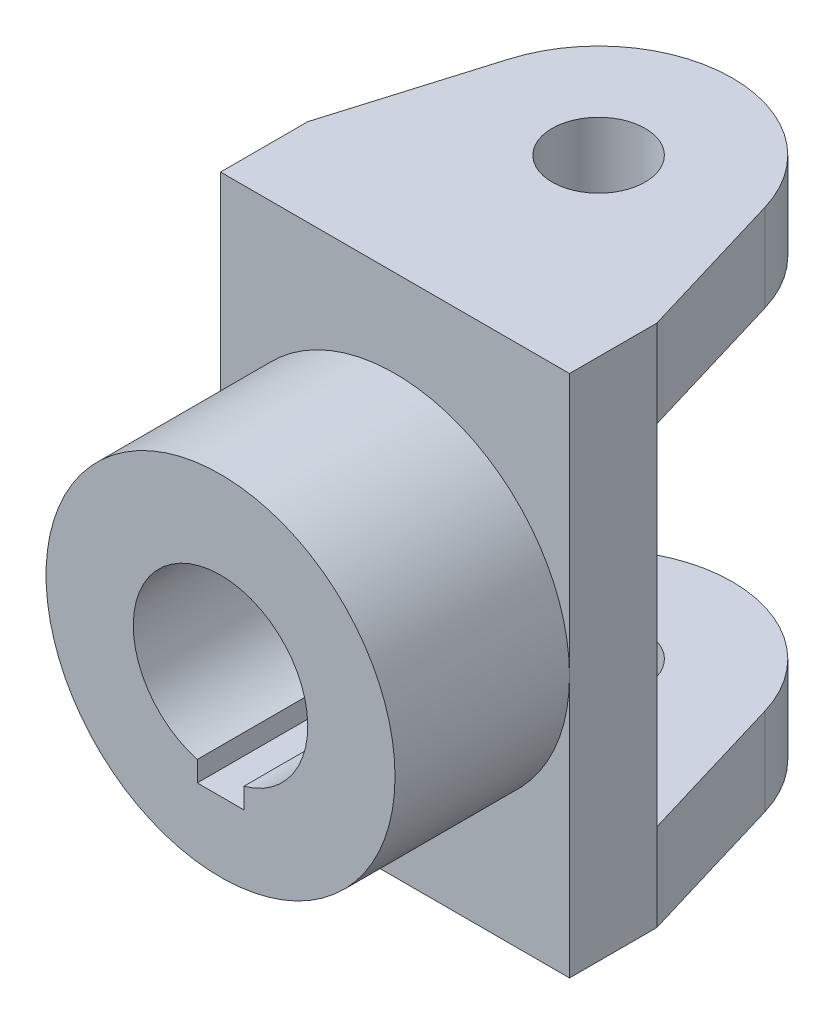
ISO-10303-21;
HEADER;
FILE_DESCRIPTION(('STEP AP214'),'2;1');
FILE_NAME('part.step','',(''),(''),'','','');
FILE_SCHEMA(('AUTOMOTIVE_DESIGN { 1 0 10303 214 1 1 1 1 }'));
ENDSEC;
DATA;
#1=APPLICATION_CONTEXT('core data for automotive mechanical design processes');
#2=APPLICATION_PROTOCOL_DEFINITION('international standard','automotive_design',2000,#1);
#3=PRODUCT_CONTEXT('',#1,'mechanical');
#4=PRODUCT('Part','Part','',(#3));
#5=PRODUCT_RELATED_PRODUCT_CATEGORY('part','',(#4));
#6=PRODUCT_DEFINITION_FORMATION('','',#4);
#7=PRODUCT_DEFINITION_CONTEXT('part definition',#1,'design');
#8=PRODUCT_DEFINITION('design','',#6,#7);
#9=PRODUCT_DEFINITION_SHAPE('','',#8);
#10=(LENGTH_UNIT() NAMED_UNIT(*) SI_UNIT(.MILLI.,.METRE.));
#11=(NAMED_UNIT(*) PLANE_ANGLE_UNIT() SI_UNIT($,.RADIAN.));
#12=(NAMED_UNIT(*) SI_UNIT($,.STERADIAN.) SOLID_ANGLE_UNIT());
#13=UNCERTAINTY_MEASURE_WITH_UNIT(LENGTH_MEASURE(1.E-05),#10,'distance_accuracy_value','');
#14=(GEOMETRIC_REPRESENTATION_CONTEXT(3) GLOBAL_UNCERTAINTY_ASSIGNED_CONTEXT((#13)) GLOBAL_UNIT_ASSIGNED_CONTEXT((#10,
#11,#12)) REPRESENTATION_CONTEXT('',''));
#15=CARTESIAN_POINT('',(0.,0.,0.));
#16=DIRECTION('',(0.,0.,1.));
#17=DIRECTION('',(1.,0.,0.));
#18=AXIS2_PLACEMENT_3D('',#15,#16,#17);
#19=CARTESIAN_POINT('',(0.,0.,-45.));
#20=DIRECTION('',(0.,0.,1.));
#21=DIRECTION('',(1.,0.,0.));
#22=AXIS2_PLACEMENT_3D('',#19,#20,#21);
#23=PLANE('',#22);
#24=DIRECTION('',(1.,0.,0.));
#25=VECTOR('',#24,1.);
#26=CARTESIAN_POINT('',(0.,-30.,-45.));
#27=LINE('',#26,#25);
#28=CARTESIAN_POINT('',(-30.,-30.,-45.));
#29=VERTEX_POINT('',#28);
#30=CARTESIAN_POINT('',(30.,-30.,-45.));
#31=VERTEX_POINT('',#30);
#32=EDGE_CURVE('E11',#29,#31,#27,.T.);
#33=ORIENTED_EDGE('',*,*,#32,.F.);
#34=DIRECTION('',(0.,1.,0.));
#35=VECTOR('',#34,1.);
#36=CARTESIAN_POINT('',(-30.,45.,-45.));
#37=LINE('',#36,#35);
#38=CARTESIAN_POINT('',(-30.,30.,-45.));
#39=VERTEX_POINT('',#38);
#40=EDGE_CURVE('E217',#29,#39,#37,.T.);
#41=ORIENTED_EDGE('',*,*,#40,.T.);
#42=DIRECTION('',(-1.,0.,0.));
#43=VECTOR('',#42,1.);
#44=CARTESIAN_POINT('',(0.,30.,-45.));
#45=LINE('',#44,#43);
#46=CARTESIAN_POINT('',(30.,30.,-45.));
#47=VERTEX_POINT('',#46);
#48=EDGE_CURVE('E50',#47,#39,#45,.T.);
#49=ORIENTED_EDGE('',*,*,#48,.F.);
#50=DIRECTION('',(0.,-1.,0.));
#51=VECTOR('',#50,1.);
#52=CARTESIAN_POINT('',(30.,45.,-45.));
#53=LINE('',#52,#51);
#54=EDGE_CURVE('E218',#47,#31,#53,.T.);
#55=ORIENTED_EDGE('',*,*,#54,.T.);
#56=EDGE_LOOP('',(#33,#41,#49,#55));
#57=FACE_BOUND('',#56,.T.);
#58=ADVANCED_FACE('F39',(#57),#23,.F.);
#59=CARTESIAN_POINT('',(0.,0.,-30.));
#60=DIRECTION('',(0.,0.,1.));
#61=DIRECTION('',(1.,0.,0.));
#62=AXIS2_PLACEMENT_3D('',#59,#60,#61);
#63=CYLINDRICAL_SURFACE('',#62,30.);
#64=CARTESIAN_POINT('',(0.,0.,-30.));
#65=DIRECTION('',(0.,0.,1.));
#66=DIRECTION('',(1.,0.,0.));
#67=AXIS2_PLACEMENT_3D('',#64,#65,#66);
#68=CIRCLE('',#67,30.);
#69=CARTESIAN_POINT('',(30.,0.,-30.));
#70=VERTEX_POINT('',#69);
#71=CARTESIAN_POINT('',(-30.,0.,-30.));
#72=VERTEX_POINT('',#71);
#73=EDGE_CURVE('E277',#70,#72,#68,.T.);
#74=ORIENTED_EDGE('',*,*,#73,.T.);
#75=EDGE_CURVE('E276',#72,#70,#68,.T.);
#76=ORIENTED_EDGE('',*,*,#75,.T.);
#77=EDGE_LOOP('',(#74,#76));
#78=FACE_BOUND('',#77,.T.);
#79=CARTESIAN_POINT('',(0.,0.,0.));
#80=DIRECTION('',(0.,0.,1.));
#81=DIRECTION('',(1.,0.,0.));
#82=AXIS2_PLACEMENT_3D('',#79,#80,#81);
#83=CIRCLE('',#82,30.);
#84=CARTESIAN_POINT('',(30.,0.,0.));
#85=VERTEX_POINT('',#84);
#86=EDGE_CURVE('E267',#85,#85,#83,.T.);
#87=ORIENTED_EDGE('',*,*,#86,.F.);
#88=EDGE_LOOP('',(#87));
#89=FACE_BOUND('',#88,.T.);
#90=ADVANCED_FACE('F41',(#78,#89),#63,.T.);
#91=CARTESIAN_POINT('',(0.,0.,0.));
#92=DIRECTION('',(0.,0.,1.));
#93=DIRECTION('',(1.,0.,0.));
#94=AXIS2_PLACEMENT_3D('',#91,#92,#93);
#95=PLANE('',#94);
#96=CARTESIAN_POINT('',(0.,0.,0.));
#97=DIRECTION('',(0.,0.,1.));
#98=DIRECTION('',(1.,0.,0.));
#99=AXIS2_PLACEMENT_3D('',#96,#97,#98);
#100=CIRCLE('',#99,15.);
#101=CARTESIAN_POINT('',(4.,-14.456832294801,0.));
#102=VERTEX_POINT('',#101);
#103=CARTESIAN_POINT('',(-4.,-14.456832294801,0.));
#104=VERTEX_POINT('',#103);
#105=EDGE_CURVE('E244',#102,#104,#100,.T.);
#106=ORIENTED_EDGE('',*,*,#105,.F.);
#107=DIRECTION('',(0.,1.,0.));
#108=VECTOR('',#107,1.);
#109=CARTESIAN_POINT('',(4.,-14.456832294801,0.));
#110=LINE('',#109,#108);
#111=CARTESIAN_POINT('',(4.,-17.956832294801,0.));
#112=VERTEX_POINT('',#111);
#113=EDGE_CURVE('E247',#112,#102,#110,.T.);
#114=ORIENTED_EDGE('',*,*,#113,.F.);
#115=DIRECTION('',(1.,0.,0.));
#116=VECTOR('',#115,1.);
#117=CARTESIAN_POINT('',(-4.,-17.956832294801,0.));
#118=LINE('',#117,#116);
#119=CARTESIAN_POINT('',(-4.,-17.956832294801,0.));
#120=VERTEX_POINT('',#119);
#121=EDGE_CURVE('E265',#120,#112,#118,.T.);
#122=ORIENTED_EDGE('',*,*,#121,.F.);
#123=DIRECTION('',(0.,-1.,0.));
#124=VECTOR('',#123,1.);
#125=CARTESIAN_POINT('',(-4.,-14.456832294801,0.));
#126=LINE('',#125,#124);
#127=EDGE_CURVE('E259',#104,#120,#126,.T.);
#128=ORIENTED_EDGE('',*,*,#127,.F.);
#129=EDGE_LOOP('',(#106,#114,#122,#128));
#130=FACE_BOUND('',#129,.T.);
#131=ORIENTED_EDGE('',*,*,#86,.T.);
#132=EDGE_LOOP('',(#131));
#133=FACE_BOUND('',#132,.T.);
#134=ADVANCED_FACE('F307',(#130,#133),#95,.T.);
#135=CARTESIAN_POINT('',(0.,0.,-30.));
#136=DIRECTION('',(0.,0.,1.));
#137=DIRECTION('',(1.,0.,0.));
#138=AXIS2_PLACEMENT_3D('',#135,#136,#137);
#139=CYLINDRICAL_SURFACE('',#138,15.);
#140=ORIENTED_EDGE('',*,*,#105,.T.);
#141=DIRECTION('',(0.,0.,1.));
#142=VECTOR('',#141,1.);
#143=CARTESIAN_POINT('',(-4.,-14.456832294801,-30.));
#144=LINE('',#143,#142);
#145=CARTESIAN_POINT('',(-4.,-14.456832294801,-30.));
#146=VERTEX_POINT('',#145);
#147=EDGE_CURVE('E260',#146,#104,#144,.T.);
#148=ORIENTED_EDGE('',*,*,#147,.F.);
#149=CARTESIAN_POINT('',(0.,0.,-30.));
#150=DIRECTION('',(0.,0.,1.));
#151=DIRECTION('',(1.,0.,0.));
#152=AXIS2_PLACEMENT_3D('',#149,#150,#151);
#153=CIRCLE('',#152,15.);
#154=CARTESIAN_POINT('',(4.,-14.456832294801,-30.));
#155=VERTEX_POINT('',#154);
#156=EDGE_CURVE('E241',#155,#146,#153,.T.);
#157=ORIENTED_EDGE('',*,*,#156,.F.);
#158=DIRECTION('',(0.,0.,1.));
#159=VECTOR('',#158,1.);
#160=CARTESIAN_POINT('',(4.,-14.456832294801,-30.));
#161=LINE('',#160,#159);
#162=EDGE_CURVE('E270',#155,#102,#161,.T.);
#163=ORIENTED_EDGE('',*,*,#162,.T.);
#164=EDGE_LOOP('',(#140,#148,#157,#163));
#165=FACE_BOUND('',#164,.T.);
#166=ADVANCED_FACE('F340',(#165),#139,.F.);
#167=CARTESIAN_POINT('',(4.,-14.456832294801,-30.));
#168=DIRECTION('',(1.,0.,0.));
#169=DIRECTION('',(0.,1.,0.));
#170=AXIS2_PLACEMENT_3D('',#167,#168,#169);
#171=PLANE('',#170);
#172=ORIENTED_EDGE('',*,*,#113,.T.);
#173=ORIENTED_EDGE('',*,*,#162,.F.);
#174=DIRECTION('',(0.,1.,0.));
#175=VECTOR('',#174,1.);
#176=CARTESIAN_POINT('',(4.,-14.456832294801,-30.));
#177=LINE('',#176,#175);
#178=CARTESIAN_POINT('',(4.,-17.956832294801,-30.));
#179=VERTEX_POINT('',#178);
#180=EDGE_CURVE('E255',#179,#155,#177,.T.);
#181=ORIENTED_EDGE('',*,*,#180,.F.);
#182=DIRECTION('',(0.,0.,1.));
#183=VECTOR('',#182,1.);
#184=CARTESIAN_POINT('',(4.,-17.956832294801,-30.));
#185=LINE('',#184,#183);
#186=EDGE_CURVE('E269',#179,#112,#185,.T.);
#187=ORIENTED_EDGE('',*,*,#186,.T.);
#188=EDGE_LOOP('',(#172,#173,#181,#187));
#189=FACE_BOUND('',#188,.T.);
#190=ADVANCED_FACE('F334',(#189),#171,.F.);
#191=CARTESIAN_POINT('',(-4.,-17.956832294801,-30.));
#192=DIRECTION('',(0.,-1.,0.));
#193=DIRECTION('',(0.,0.,-1.));
#194=AXIS2_PLACEMENT_3D('',#191,#192,#193);
#195=PLANE('',#194);
#196=ORIENTED_EDGE('',*,*,#121,.T.);
#197=ORIENTED_EDGE('',*,*,#186,.F.);
#198=DIRECTION('',(1.,0.,0.));
#199=VECTOR('',#198,1.);
#200=CARTESIAN_POINT('',(-4.,-17.956832294801,-30.));
#201=LINE('',#200,#199);
#202=CARTESIAN_POINT('',(-4.,-17.956832294801,-30.));
#203=VERTEX_POINT('',#202);
#204=EDGE_CURVE('E253',#203,#179,#201,.T.);
#205=ORIENTED_EDGE('',*,*,#204,.F.);
#206=DIRECTION('',(0.,0.,1.));
#207=VECTOR('',#206,1.);
#208=CARTESIAN_POINT('',(-4.,-17.956832294801,-30.));
#209=LINE('',#208,#207);
#210=EDGE_CURVE('E275',#203,#120,#209,.T.);
#211=ORIENTED_EDGE('',*,*,#210,.T.);
#212=EDGE_LOOP('',(#196,#197,#205,#211));
#213=FACE_BOUND('',#212,.T.);
#214=ADVANCED_FACE('F337',(#213),#195,.F.);
#215=CARTESIAN_POINT('',(-4.,-14.456832294801,-30.));
#216=DIRECTION('',(-1.,0.,0.));
#217=DIRECTION('',(0.,-1.,0.));
#218=AXIS2_PLACEMENT_3D('',#215,#216,#217);
#219=PLANE('',#218);
#220=ORIENTED_EDGE('',*,*,#127,.T.);
#221=ORIENTED_EDGE('',*,*,#210,.F.);
#222=DIRECTION('',(0.,-1.,0.));
#223=VECTOR('',#222,1.);
#224=CARTESIAN_POINT('',(-4.,-14.456832294801,-30.));
#225=LINE('',#224,#223);
#226=EDGE_CURVE('E250',#146,#203,#225,.T.);
#227=ORIENTED_EDGE('',*,*,#226,.F.);
#228=ORIENTED_EDGE('',*,*,#147,.T.);
#229=EDGE_LOOP('',(#220,#221,#227,#228));
#230=FACE_BOUND('',#229,.T.);
#231=ADVANCED_FACE('F325',(#230),#219,.F.);
#232=CARTESIAN_POINT('',(-30.,45.,-45.));
#233=DIRECTION('',(0.,-1.,0.));
#234=DIRECTION('',(1.,0.,0.));
#235=AXIS2_PLACEMENT_3D('',#232,#233,#234);
#236=PLANE('',#235);
#237=DIRECTION('',(1.,0.,0.));
#238=VECTOR('',#237,1.);
#239=CARTESIAN_POINT('',(-30.,45.,-30.));
#240=LINE('',#239,#238);
#241=CARTESIAN_POINT('',(-30.,45.,-30.));
#242=VERTEX_POINT('',#241);
#243=CARTESIAN_POINT('',(30.,45.,-30.));
#244=VERTEX_POINT('',#243);
#245=EDGE_CURVE('E228',#242,#244,#240,.T.);
#246=ORIENTED_EDGE('',*,*,#245,.T.);
#247=DIRECTION('',(0.,0.,1.));
#248=VECTOR('',#247,1.);
#249=CARTESIAN_POINT('',(30.,45.,-45.));
#250=LINE('',#249,#248);
#251=CARTESIAN_POINT('',(30.,45.,-45.));
#252=VERTEX_POINT('',#251);
#253=EDGE_CURVE('E222',#252,#244,#250,.T.);
#254=ORIENTED_EDGE('',*,*,#253,.F.);
#255=DIRECTION('',(-0.286928155857607,0.,-0.957952103905071));
#256=VECTOR('',#255,1.);
#257=CARTESIAN_POINT('',(22.0328983898166,45.,-71.599347584725));
#258=LINE('',#257,#256);
#259=CARTESIAN_POINT('',(22.0328983898166,45.,-71.599347584725));
#260=VERTEX_POINT('',#259);
#261=EDGE_CURVE('E201',#252,#260,#258,.T.);
#262=ORIENTED_EDGE('',*,*,#261,.T.);
#263=CARTESIAN_POINT('',(0.,45.,-65.));
#264=DIRECTION('',(0.,1.,0.));
#265=DIRECTION('',(-1.,0.,0.));
#266=AXIS2_PLACEMENT_3D('',#263,#264,#265);
#267=CIRCLE('',#266,23.);
#268=CARTESIAN_POINT('',(-22.0328983898166,45.,-71.599347584725));
#269=VERTEX_POINT('',#268);
#270=EDGE_CURVE('E193',#260,#269,#267,.T.);
#271=ORIENTED_EDGE('',*,*,#270,.T.);
#272=DIRECTION('',(-0.286928155857607,0.,0.957952103905071));
#273=VECTOR('',#272,1.);
#274=CARTESIAN_POINT('',(-30.,45.,-45.));
#275=LINE('',#274,#273);
#276=CARTESIAN_POINT('',(-30.,45.,-45.));
#277=VERTEX_POINT('',#276);
#278=EDGE_CURVE('E190',#269,#277,#275,.T.);
#279=ORIENTED_EDGE('',*,*,#278,.T.);
#280=DIRECTION('',(0.,0.,1.));
#281=VECTOR('',#280,1.);
#282=CARTESIAN_POINT('',(-30.,45.,-45.));
#283=LINE('',#282,#281);
#284=EDGE_CURVE('E233',#277,#242,#283,.T.);
#285=ORIENTED_EDGE('',*,*,#284,.T.);
#286=EDGE_LOOP('',(#246,#254,#262,#271,#279,#285));
#287=FACE_BOUND('',#286,.T.);
#288=CARTESIAN_POINT('',(0.,45.,-65.));
#289=DIRECTION('',(0.,1.,0.));
#290=DIRECTION('',(-1.,0.,0.));
#291=AXIS2_PLACEMENT_3D('',#288,#289,#290);
#292=CIRCLE('',#291,8.);
#293=CARTESIAN_POINT('',(-8.,45.,-65.));
#294=VERTEX_POINT('',#293);
#295=EDGE_CURVE('E185',#294,#294,#292,.T.);
#296=ORIENTED_EDGE('',*,*,#295,.F.);
#297=EDGE_LOOP('',(#296));
#298=FACE_BOUND('',#297,.T.);
#299=ADVANCED_FACE('F318',(#287,#298),#236,.F.);
#300=CARTESIAN_POINT('',(-30.,45.,-45.));
#301=DIRECTION('',(1.,0.,0.));
#302=DIRECTION('',(0.,1.,0.));
#303=AXIS2_PLACEMENT_3D('',#300,#301,#302);
#304=PLANE('',#303);
#305=ORIENTED_EDGE('',*,*,#40,.F.);
#306=CARTESIAN_POINT('',(-30.,-45.,-45.));
#307=VERTEX_POINT('',#306);
#308=EDGE_CURVE('E167',#307,#29,#37,.T.);
#309=ORIENTED_EDGE('',*,*,#308,.F.);
#310=DIRECTION('',(0.,0.,1.));
#311=VECTOR('',#310,1.);
#312=CARTESIAN_POINT('',(-30.,-45.,-45.));
#313=LINE('',#312,#311);
#314=CARTESIAN_POINT('',(-30.,-45.,-30.));
#315=VERTEX_POINT('',#314);
#316=EDGE_CURVE('E240',#307,#315,#313,.T.);
#317=ORIENTED_EDGE('',*,*,#316,.T.);
#318=DIRECTION('',(0.,1.,0.));
#319=VECTOR('',#318,1.);
#320=CARTESIAN_POINT('',(-30.,45.,-30.));
#321=LINE('',#320,#319);
#322=EDGE_CURVE('E229',#315,#72,#321,.T.);
#323=ORIENTED_EDGE('',*,*,#322,.T.);
#324=EDGE_CURVE('E230',#72,#242,#321,.T.);
#325=ORIENTED_EDGE('',*,*,#324,.T.);
#326=ORIENTED_EDGE('',*,*,#284,.F.);
#327=DIRECTION('',(0.,1.,0.));
#328=VECTOR('',#327,1.);
#329=CARTESIAN_POINT('',(-30.,30.,-45.));
#330=LINE('',#329,#328);
#331=EDGE_CURVE('E199',#39,#277,#330,.T.);
#332=ORIENTED_EDGE('',*,*,#331,.F.);
#333=EDGE_LOOP('',(#305,#309,#317,#323,#325,#326,#332));
#334=FACE_BOUND('',#333,.T.);
#335=ADVANCED_FACE('F321',(#334),#304,.F.);
#336=CARTESIAN_POINT('',(-30.,-45.,-45.));
#337=DIRECTION('',(0.,1.,0.));
#338=DIRECTION('',(-1.,0.,0.));
#339=AXIS2_PLACEMENT_3D('',#336,#337,#338);
#340=PLANE('',#339);
#341=DIRECTION('',(-1.,0.,0.));
#342=VECTOR('',#341,1.);
#343=CARTESIAN_POINT('',(-30.,-45.,-30.));
#344=LINE('',#343,#342);
#345=CARTESIAN_POINT('',(30.,-45.,-30.));
#346=VERTEX_POINT('',#345);
#347=EDGE_CURVE('E223',#346,#315,#344,.T.);
#348=ORIENTED_EDGE('',*,*,#347,.T.);
#349=ORIENTED_EDGE('',*,*,#316,.F.);
#350=DIRECTION('',(-0.286928155857607,0.,0.957952103905071));
#351=VECTOR('',#350,1.);
#352=CARTESIAN_POINT('',(-30.,-45.,-45.));
#353=LINE('',#352,#351);
#354=CARTESIAN_POINT('',(-22.0328983898166,-45.,-71.599347584725));
#355=VERTEX_POINT('',#354);
#356=EDGE_CURVE('E173',#355,#307,#353,.T.);
#357=ORIENTED_EDGE('',*,*,#356,.F.);
#358=CARTESIAN_POINT('',(0.,-45.,-65.));
#359=DIRECTION('',(0.,1.,0.));
#360=DIRECTION('',(-1.,0.,0.));
#361=AXIS2_PLACEMENT_3D('',#358,#359,#360);
#362=CIRCLE('',#361,23.);
#363=CARTESIAN_POINT('',(22.0328983898166,-45.,-71.599347584725));
#364=VERTEX_POINT('',#363);
#365=EDGE_CURVE('E158',#364,#355,#362,.T.);
#366=ORIENTED_EDGE('',*,*,#365,.F.);
#367=DIRECTION('',(-0.286928155857607,0.,-0.957952103905071));
#368=VECTOR('',#367,1.);
#369=CARTESIAN_POINT('',(22.0328983898166,-45.,-71.599347584725));
#370=LINE('',#369,#368);
#371=CARTESIAN_POINT('',(30.,-45.,-45.));
#372=VERTEX_POINT('',#371);
#373=EDGE_CURVE('E170',#372,#364,#370,.T.);
#374=ORIENTED_EDGE('',*,*,#373,.F.);
#375=DIRECTION('',(0.,0.,1.));
#376=VECTOR('',#375,1.);
#377=CARTESIAN_POINT('',(30.,-45.,-45.));
#378=LINE('',#377,#376);
#379=EDGE_CURVE('E238',#372,#346,#378,.T.);
#380=ORIENTED_EDGE('',*,*,#379,.T.);
#381=EDGE_LOOP('',(#348,#349,#357,#366,#374,#380));
#382=FACE_BOUND('',#381,.T.);
#383=CARTESIAN_POINT('',(0.,-45.,-65.));
#384=DIRECTION('',(0.,1.,0.));
#385=DIRECTION('',(-1.,0.,0.));
#386=AXIS2_PLACEMENT_3D('',#383,#384,#385);
#387=CIRCLE('',#386,8.);
#388=CARTESIAN_POINT('',(-8.,-45.,-65.));
#389=VERTEX_POINT('',#388);
#390=EDGE_CURVE('E172',#389,#389,#387,.T.);
#391=ORIENTED_EDGE('',*,*,#390,.T.);
#392=EDGE_LOOP('',(#391));
#393=FACE_BOUND('',#392,.T.);
#394=ADVANCED_FACE('F326',(#382,#393),#340,.F.);
#395=CARTESIAN_POINT('',(30.,45.,-45.));
#396=DIRECTION('',(-1.,0.,0.));
#397=DIRECTION('',(0.,-1.,0.));
#398=AXIS2_PLACEMENT_3D('',#395,#396,#397);
#399=PLANE('',#398);
#400=DIRECTION('',(0.,-1.,0.));
#401=VECTOR('',#400,1.);
#402=CARTESIAN_POINT('',(30.,45.,-30.));
#403=LINE('',#402,#401);
#404=EDGE_CURVE('E209',#70,#346,#403,.T.);
#405=ORIENTED_EDGE('',*,*,#404,.T.);
#406=ORIENTED_EDGE('',*,*,#379,.F.);
#407=DIRECTION('',(0.,-1.,0.));
#408=VECTOR('',#407,1.);
#409=CARTESIAN_POINT('',(30.,-30.,-45.));
#410=LINE('',#409,#408);
#411=EDGE_CURVE('E178',#31,#372,#410,.T.);
#412=ORIENTED_EDGE('',*,*,#411,.F.);
#413=ORIENTED_EDGE('',*,*,#54,.F.);
#414=EDGE_CURVE('E214',#252,#47,#53,.T.);
#415=ORIENTED_EDGE('',*,*,#414,.F.);
#416=ORIENTED_EDGE('',*,*,#253,.T.);
#417=EDGE_CURVE('E225',#244,#70,#403,.T.);
#418=ORIENTED_EDGE('',*,*,#417,.T.);
#419=EDGE_LOOP('',(#405,#406,#412,#413,#415,#416,#418));
#420=FACE_BOUND('',#419,.T.);
#421=ADVANCED_FACE('F299',(#420),#399,.F.);
#422=CARTESIAN_POINT('',(0.,0.,-30.));
#423=DIRECTION('',(0.,0.,1.));
#424=DIRECTION('',(1.,0.,0.));
#425=AXIS2_PLACEMENT_3D('',#422,#423,#424);
#426=PLANE('',#425);
#427=ORIENTED_EDGE('',*,*,#404,.F.);
#428=ORIENTED_EDGE('',*,*,#75,.F.);
#429=ORIENTED_EDGE('',*,*,#322,.F.);
#430=ORIENTED_EDGE('',*,*,#347,.F.);
#431=EDGE_LOOP('',(#427,#428,#429,#430));
#432=FACE_BOUND('',#431,.T.);
#433=ADVANCED_FACE('F320',(#432),#426,.T.);
#434=ORIENTED_EDGE('',*,*,#73,.F.);
#435=ORIENTED_EDGE('',*,*,#417,.F.);
#436=ORIENTED_EDGE('',*,*,#245,.F.);
#437=ORIENTED_EDGE('',*,*,#324,.F.);
#438=EDGE_LOOP('',(#434,#435,#436,#437));
#439=FACE_BOUND('',#438,.T.);
#440=ADVANCED_FACE('F312',(#439),#426,.T.);
#441=ORIENTED_EDGE('',*,*,#204,.T.);
#442=ORIENTED_EDGE('',*,*,#180,.T.);
#443=ORIENTED_EDGE('',*,*,#156,.T.);
#444=ORIENTED_EDGE('',*,*,#226,.T.);
#445=EDGE_LOOP('',(#441,#442,#443,#444));
#446=FACE_BOUND('',#445,.T.);
#447=ADVANCED_FACE('F315',(#446),#426,.T.);
#448=CARTESIAN_POINT('',(0.,30.,-65.));
#449=DIRECTION('',(0.,1.,0.));
#450=DIRECTION('',(-1.,0.,0.));
#451=AXIS2_PLACEMENT_3D('',#448,#449,#450);
#452=PLANE('',#451);
#453=CARTESIAN_POINT('',(0.,30.,-65.));
#454=DIRECTION('',(0.,1.,0.));
#455=DIRECTION('',(-1.,0.,0.));
#456=AXIS2_PLACEMENT_3D('',#453,#454,#455);
#457=CIRCLE('',#456,8.);
#458=CARTESIAN_POINT('',(-8.,30.,-65.));
#459=VERTEX_POINT('',#458);
#460=EDGE_CURVE('E184',#459,#459,#457,.T.);
#461=ORIENTED_EDGE('',*,*,#460,.T.);
#462=EDGE_LOOP('',(#461));
#463=FACE_BOUND('',#462,.T.);
#464=DIRECTION('',(-0.286928155857607,0.,-0.957952103905071));
#465=VECTOR('',#464,1.);
#466=CARTESIAN_POINT('',(22.0328983898166,30.,-71.599347584725));
#467=LINE('',#466,#465);
#468=CARTESIAN_POINT('',(22.0328983898166,30.,-71.599347584725));
#469=VERTEX_POINT('',#468);
#470=EDGE_CURVE('E192',#47,#469,#467,.T.);
#471=ORIENTED_EDGE('',*,*,#470,.F.);
#472=ORIENTED_EDGE('',*,*,#48,.T.);
#473=DIRECTION('',(-0.286928155857607,0.,0.957952103905071));
#474=VECTOR('',#473,1.);
#475=CARTESIAN_POINT('',(-30.,30.,-45.));
#476=LINE('',#475,#474);
#477=CARTESIAN_POINT('',(-22.0328983898166,30.,-71.599347584725));
#478=VERTEX_POINT('',#477);
#479=EDGE_CURVE('E188',#478,#39,#476,.T.);
#480=ORIENTED_EDGE('',*,*,#479,.F.);
#481=CARTESIAN_POINT('',(0.,30.,-65.));
#482=DIRECTION('',(0.,1.,0.));
#483=DIRECTION('',(-1.,0.,0.));
#484=AXIS2_PLACEMENT_3D('',#481,#482,#483);
#485=CIRCLE('',#484,23.);
#486=EDGE_CURVE('E197',#469,#478,#485,.T.);
#487=ORIENTED_EDGE('',*,*,#486,.F.);
#488=EDGE_LOOP('',(#471,#472,#480,#487));
#489=FACE_BOUND('',#488,.T.);
#490=ADVANCED_FACE('F281',(#463,#489),#452,.F.);
#491=CARTESIAN_POINT('',(-30.,30.,-45.));
#492=DIRECTION('',(-0.957952103905072,0.,-0.286928155857607));
#493=DIRECTION('',(-0.286928155857607,0.,0.957952103905072));
#494=AXIS2_PLACEMENT_3D('',#491,#492,#493);
#495=PLANE('',#494);
#496=ORIENTED_EDGE('',*,*,#278,.F.);
#497=DIRECTION('',(0.,1.,0.));
#498=VECTOR('',#497,1.);
#499=CARTESIAN_POINT('',(-22.0328983898166,30.,-71.599347584725));
#500=LINE('',#499,#498);
#501=EDGE_CURVE('E208',#478,#269,#500,.T.);
#502=ORIENTED_EDGE('',*,*,#501,.F.);
#503=ORIENTED_EDGE('',*,*,#479,.T.);
#504=ORIENTED_EDGE('',*,*,#331,.T.);
#505=EDGE_LOOP('',(#496,#502,#503,#504));
#506=FACE_BOUND('',#505,.T.);
#507=ADVANCED_FACE('F287',(#506),#495,.T.);
#508=CARTESIAN_POINT('',(0.,30.,-65.));
#509=DIRECTION('',(0.,1.,0.));
#510=DIRECTION('',(-1.,0.,0.));
#511=AXIS2_PLACEMENT_3D('',#508,#509,#510);
#512=CYLINDRICAL_SURFACE('',#511,23.);
#513=ORIENTED_EDGE('',*,*,#270,.F.);
#514=DIRECTION('',(0.,1.,0.));
#515=VECTOR('',#514,1.);
#516=CARTESIAN_POINT('',(22.0328983898166,30.,-71.599347584725));
#517=LINE('',#516,#515);
#518=EDGE_CURVE('E211',#469,#260,#517,.T.);
#519=ORIENTED_EDGE('',*,*,#518,.F.);
#520=ORIENTED_EDGE('',*,*,#486,.T.);
#521=ORIENTED_EDGE('',*,*,#501,.T.);
#522=EDGE_LOOP('',(#513,#519,#520,#521));
#523=FACE_BOUND('',#522,.T.);
#524=ADVANCED_FACE('F295',(#523),#512,.T.);
#525=CARTESIAN_POINT('',(22.0328983898166,30.,-71.599347584725));
#526=DIRECTION('',(0.957952103905071,0.,-0.286928155857607));
#527=DIRECTION('',(-0.286928155857607,0.,-0.957952103905071));
#528=AXIS2_PLACEMENT_3D('',#525,#526,#527);
#529=PLANE('',#528);
#530=ORIENTED_EDGE('',*,*,#261,.F.);
#531=ORIENTED_EDGE('',*,*,#414,.T.);
#532=ORIENTED_EDGE('',*,*,#470,.T.);
#533=ORIENTED_EDGE('',*,*,#518,.T.);
#534=EDGE_LOOP('',(#530,#531,#532,#533));
#535=FACE_BOUND('',#534,.T.);
#536=ADVANCED_FACE('F293',(#535),#529,.T.);
#537=CARTESIAN_POINT('',(0.,30.,-65.));
#538=DIRECTION('',(0.,1.,0.));
#539=DIRECTION('',(-1.,0.,0.));
#540=AXIS2_PLACEMENT_3D('',#537,#538,#539);
#541=CYLINDRICAL_SURFACE('',#540,8.);
#542=ORIENTED_EDGE('',*,*,#460,.F.);
#543=EDGE_LOOP('',(#542));
#544=FACE_BOUND('',#543,.T.);
#545=ORIENTED_EDGE('',*,*,#295,.T.);
#546=EDGE_LOOP('',(#545));
#547=FACE_BOUND('',#546,.T.);
#548=ADVANCED_FACE('F428',(#544,#547),#541,.F.);
#549=CARTESIAN_POINT('',(0.,-30.,-65.));
#550=DIRECTION('',(0.,-1.,0.));
#551=DIRECTION('',(-1.,0.,0.));
#552=AXIS2_PLACEMENT_3D('',#549,#550,#551);
#553=PLANE('',#552);
#554=CARTESIAN_POINT('',(0.,-30.,-65.));
#555=DIRECTION('',(0.,1.,0.));
#556=DIRECTION('',(-1.,0.,0.));
#557=AXIS2_PLACEMENT_3D('',#554,#555,#556);
#558=CIRCLE('',#557,8.);
#559=CARTESIAN_POINT('',(-8.,-30.,-65.));
#560=VERTEX_POINT('',#559);
#561=EDGE_CURVE('E180',#560,#560,#558,.T.);
#562=ORIENTED_EDGE('',*,*,#561,.F.);
#563=EDGE_LOOP('',(#562));
#564=FACE_BOUND('',#563,.T.);
#565=DIRECTION('',(-0.286928155857607,0.,0.957952103905071));
#566=VECTOR('',#565,1.);
#567=CARTESIAN_POINT('',(-30.,-30.,-45.));
#568=LINE('',#567,#566);
#569=CARTESIAN_POINT('',(-22.0328983898166,-30.,-71.599347584725));
#570=VERTEX_POINT('',#569);
#571=EDGE_CURVE('E148',#570,#29,#568,.T.);
#572=ORIENTED_EDGE('',*,*,#571,.T.);
#573=ORIENTED_EDGE('',*,*,#32,.T.);
#574=DIRECTION('',(-0.286928155857607,0.,-0.957952103905071));
#575=VECTOR('',#574,1.);
#576=CARTESIAN_POINT('',(22.0328983898166,-30.,-71.599347584725));
#577=LINE('',#576,#575);
#578=CARTESIAN_POINT('',(22.0328983898166,-30.,-71.599347584725));
#579=VERTEX_POINT('',#578);
#580=EDGE_CURVE('E149',#31,#579,#577,.T.);
#581=ORIENTED_EDGE('',*,*,#580,.T.);
#582=CARTESIAN_POINT('',(0.,-30.,-65.));
#583=DIRECTION('',(0.,1.,0.));
#584=DIRECTION('',(-1.,0.,0.));
#585=AXIS2_PLACEMENT_3D('',#582,#583,#584);
#586=CIRCLE('',#585,23.);
#587=EDGE_CURVE('E142',#579,#570,#586,.T.);
#588=ORIENTED_EDGE('',*,*,#587,.T.);
#589=EDGE_LOOP('',(#572,#573,#581,#588));
#590=FACE_BOUND('',#589,.T.);
#591=ADVANCED_FACE('F145',(#564,#590),#553,.F.);
#592=CARTESIAN_POINT('',(-30.,-30.,-45.));
#593=DIRECTION('',(0.957952103905072,0.,0.286928155857607));
#594=DIRECTION('',(0.286928155857607,0.,-0.957952103905072));
#595=AXIS2_PLACEMENT_3D('',#592,#593,#594);
#596=PLANE('',#595);
#597=ORIENTED_EDGE('',*,*,#356,.T.);
#598=ORIENTED_EDGE('',*,*,#308,.T.);
#599=ORIENTED_EDGE('',*,*,#571,.F.);
#600=DIRECTION('',(0.,-1.,0.));
#601=VECTOR('',#600,1.);
#602=CARTESIAN_POINT('',(-22.0328983898166,-30.,-71.599347584725));
#603=LINE('',#602,#601);
#604=EDGE_CURVE('E154',#570,#355,#603,.T.);
#605=ORIENTED_EDGE('',*,*,#604,.T.);
#606=EDGE_LOOP('',(#597,#598,#599,#605));
#607=FACE_BOUND('',#606,.T.);
#608=ADVANCED_FACE('F163',(#607),#596,.F.);
#609=CARTESIAN_POINT('',(22.0328983898166,-30.,-71.599347584725));
#610=DIRECTION('',(-0.957952103905071,0.,0.286928155857607));
#611=DIRECTION('',(0.286928155857607,0.,0.957952103905071));
#612=AXIS2_PLACEMENT_3D('',#609,#610,#611);
#613=PLANE('',#612);
#614=ORIENTED_EDGE('',*,*,#373,.T.);
#615=DIRECTION('',(0.,-1.,0.));
#616=VECTOR('',#615,1.);
#617=CARTESIAN_POINT('',(22.0328983898166,-30.,-71.599347584725));
#618=LINE('',#617,#616);
#619=EDGE_CURVE('E165',#579,#364,#618,.T.);
#620=ORIENTED_EDGE('',*,*,#619,.F.);
#621=ORIENTED_EDGE('',*,*,#580,.F.);
#622=ORIENTED_EDGE('',*,*,#411,.T.);
#623=EDGE_LOOP('',(#614,#620,#621,#622));
#624=FACE_BOUND('',#623,.T.);
#625=ADVANCED_FACE('F469',(#624),#613,.F.);
#626=CARTESIAN_POINT('',(0.,-30.,-65.));
#627=DIRECTION('',(0.,-1.,0.));
#628=DIRECTION('',(1.,0.,0.));
#629=AXIS2_PLACEMENT_3D('',#626,#627,#628);
#630=CYLINDRICAL_SURFACE('',#629,23.);
#631=ORIENTED_EDGE('',*,*,#365,.T.);
#632=ORIENTED_EDGE('',*,*,#604,.F.);
#633=ORIENTED_EDGE('',*,*,#587,.F.);
#634=ORIENTED_EDGE('',*,*,#619,.T.);
#635=EDGE_LOOP('',(#631,#632,#633,#634));
#636=FACE_BOUND('',#635,.T.);
#637=ADVANCED_FACE('F156',(#636),#630,.T.);
#638=CARTESIAN_POINT('',(0.,-30.,-65.));
#639=DIRECTION('',(0.,-1.,0.));
#640=DIRECTION('',(1.,0.,0.));
#641=AXIS2_PLACEMENT_3D('',#638,#639,#640);
#642=CYLINDRICAL_SURFACE('',#641,8.);
#643=ORIENTED_EDGE('',*,*,#561,.T.);
#644=EDGE_LOOP('',(#643));
#645=FACE_BOUND('',#644,.T.);
#646=ORIENTED_EDGE('',*,*,#390,.F.);
#647=EDGE_LOOP('',(#646));
#648=FACE_BOUND('',#647,.T.);
#649=ADVANCED_FACE('F488',(#645,#648),#642,.F.);
#650=CLOSED_SHELL('',(#58,#90,#134,#166,#190,#214,#231,#299,#335,#394,#421,#433,#440,#447,#490,
#507,#524,#536,#548,#591,#608,#625,#637,#649));
#651=MANIFOLD_SOLID_BREP('B2',#650);
#652=ADVANCED_BREP_SHAPE_REPRESENTATION('',(#18,#651),#14);
#653=SHAPE_DEFINITION_REPRESENTATION(#9,#652);
ENDSEC;
END-ISO-10303-21;
